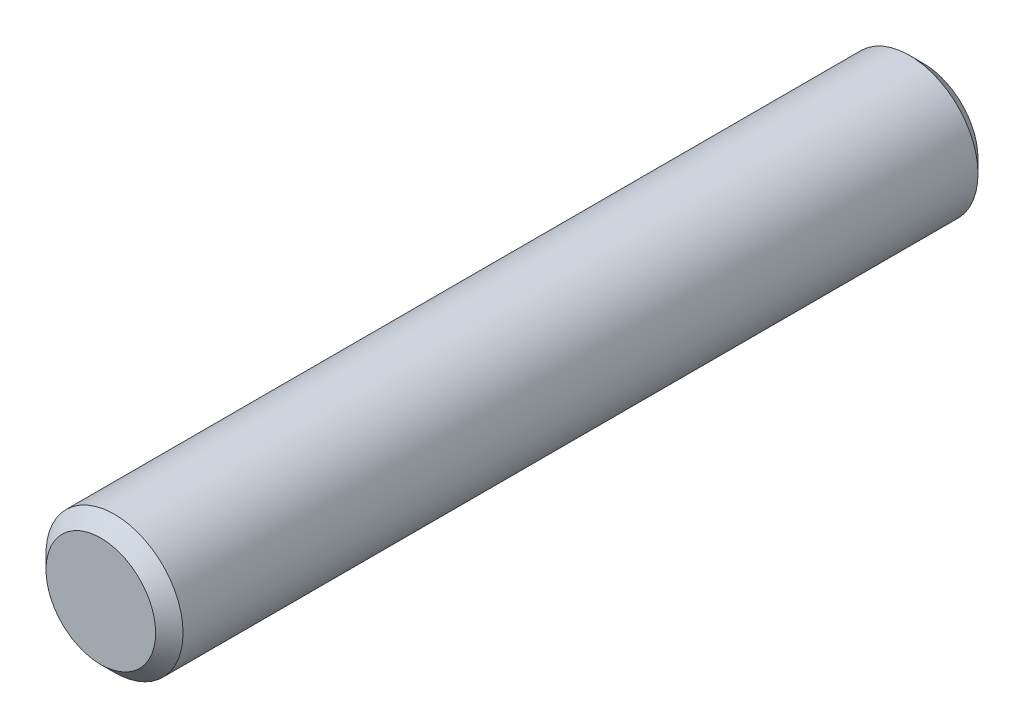
ISO-10303-21;
HEADER;
FILE_DESCRIPTION(('STEP AP214'),'2;1');
FILE_NAME('part.step','',(''),(''),'','','');
FILE_SCHEMA(('AUTOMOTIVE_DESIGN { 1 0 10303 214 1 1 1 1 }'));
ENDSEC;
DATA;
#1=APPLICATION_CONTEXT('core data for automotive mechanical design processes');
#2=APPLICATION_PROTOCOL_DEFINITION('international standard','automotive_design',2000,#1);
#3=PRODUCT_CONTEXT('',#1,'mechanical');
#4=PRODUCT('Part','Part','',(#3));
#5=PRODUCT_RELATED_PRODUCT_CATEGORY('part','',(#4));
#6=PRODUCT_DEFINITION_FORMATION('','',#4);
#7=PRODUCT_DEFINITION_CONTEXT('part definition',#1,'design');
#8=PRODUCT_DEFINITION('design','',#6,#7);
#9=PRODUCT_DEFINITION_SHAPE('','',#8);
#10=(LENGTH_UNIT() NAMED_UNIT(*) SI_UNIT(.MILLI.,.METRE.));
#11=(NAMED_UNIT(*) PLANE_ANGLE_UNIT() SI_UNIT($,.RADIAN.));
#12=(NAMED_UNIT(*) SI_UNIT($,.STERADIAN.) SOLID_ANGLE_UNIT());
#13=UNCERTAINTY_MEASURE_WITH_UNIT(LENGTH_MEASURE(1.E-05),#10,'distance_accuracy_value','');
#14=(GEOMETRIC_REPRESENTATION_CONTEXT(3) GLOBAL_UNCERTAINTY_ASSIGNED_CONTEXT((#13)) GLOBAL_UNIT_ASSIGNED_CONTEXT((#10,
#11,#12)) REPRESENTATION_CONTEXT('',''));
#15=CARTESIAN_POINT('',(0.,0.,0.));
#16=DIRECTION('',(0.,0.,1.));
#17=DIRECTION('',(1.,0.,0.));
#18=AXIS2_PLACEMENT_3D('',#15,#16,#17);
#19=CARTESIAN_POINT('',(0.,0.,60.));
#20=DIRECTION('',(0.,0.,-1.));
#21=DIRECTION('',(-1.,0.,0.));
#22=AXIS2_PLACEMENT_3D('',#19,#20,#21);
#23=CYLINDRICAL_SURFACE('',#22,5.);
#24=CARTESIAN_POINT('',(0.,0.,1.00000000000001));
#25=DIRECTION('',(0.,0.,1.));
#26=DIRECTION('',(1.,0.,0.));
#27=AXIS2_PLACEMENT_3D('',#24,#25,#26);
#28=CIRCLE('',#27,5.);
#29=CARTESIAN_POINT('',(5.,0.,1.00000000000001));
#30=VERTEX_POINT('',#29);
#31=EDGE_CURVE('E44',#30,#30,#28,.T.);
#32=ORIENTED_EDGE('',*,*,#31,.T.);
#33=EDGE_LOOP('',(#32));
#34=FACE_BOUND('',#33,.T.);
#35=CARTESIAN_POINT('',(0.,0.,59.));
#36=DIRECTION('',(0.,0.,1.));
#37=DIRECTION('',(1.,0.,0.));
#38=AXIS2_PLACEMENT_3D('',#35,#36,#37);
#39=CIRCLE('',#38,5.);
#40=CARTESIAN_POINT('',(5.,0.,59.));
#41=VERTEX_POINT('',#40);
#42=EDGE_CURVE('E48',#41,#41,#39,.F.);
#43=ORIENTED_EDGE('',*,*,#42,.T.);
#44=EDGE_LOOP('',(#43));
#45=FACE_BOUND('',#44,.T.);
#46=ADVANCED_FACE('F33',(#34,#45),#23,.T.);
#47=CARTESIAN_POINT('',(0.,0.,60.));
#48=DIRECTION('',(0.,0.,1.));
#49=DIRECTION('',(1.,0.,0.));
#50=AXIS2_PLACEMENT_3D('',#47,#48,#49);
#51=PLANE('',#50);
#52=CARTESIAN_POINT('',(0.,0.,60.));
#53=DIRECTION('',(0.,0.,1.));
#54=DIRECTION('',(1.,0.,0.));
#55=AXIS2_PLACEMENT_3D('',#52,#53,#54);
#56=CIRCLE('',#55,4.);
#57=CARTESIAN_POINT('',(4.,0.,60.));
#58=VERTEX_POINT('',#57);
#59=EDGE_CURVE('E10',#58,#58,#56,.T.);
#60=ORIENTED_EDGE('',*,*,#59,.T.);
#61=EDGE_LOOP('',(#60));
#62=FACE_BOUND('',#61,.T.);
#63=ADVANCED_FACE('F64',(#62),#51,.T.);
#64=CARTESIAN_POINT('',(0.,0.,0.));
#65=DIRECTION('',(0.,0.,1.));
#66=DIRECTION('',(1.,0.,0.));
#67=AXIS2_PLACEMENT_3D('',#64,#65,#66);
#68=PLANE('',#67);
#69=CARTESIAN_POINT('',(0.,0.,0.));
#70=DIRECTION('',(0.,0.,1.));
#71=DIRECTION('',(1.,0.,0.));
#72=AXIS2_PLACEMENT_3D('',#69,#70,#71);
#73=CIRCLE('',#72,4.);
#74=CARTESIAN_POINT('',(4.,0.,0.));
#75=VERTEX_POINT('',#74);
#76=EDGE_CURVE('E40',#75,#75,#73,.F.);
#77=ORIENTED_EDGE('',*,*,#76,.T.);
#78=EDGE_LOOP('',(#77));
#79=FACE_BOUND('',#78,.T.);
#80=ADVANCED_FACE('F61',(#79),#68,.F.);
#81=CARTESIAN_POINT('',(0.,0.,1.00000000000001));
#82=DIRECTION('',(0.,0.,1.));
#83=DIRECTION('',(1.,0.,0.));
#84=AXIS2_PLACEMENT_3D('',#81,#82,#83);
#85=CONICAL_SURFACE('',#84,5.,0.785398163397447);
#86=ORIENTED_EDGE('',*,*,#76,.F.);
#87=EDGE_LOOP('',(#86));
#88=FACE_BOUND('',#87,.T.);
#89=ORIENTED_EDGE('',*,*,#31,.F.);
#90=EDGE_LOOP('',(#89));
#91=FACE_BOUND('',#90,.T.);
#92=ADVANCED_FACE('F57',(#88,#91),#85,.T.);
#93=CARTESIAN_POINT('',(0.,0.,60.));
#94=DIRECTION('',(0.,0.,-1.));
#95=DIRECTION('',(-1.,0.,0.));
#96=AXIS2_PLACEMENT_3D('',#93,#94,#95);
#97=CONICAL_SURFACE('',#96,4.,0.785398163397443);
#98=ORIENTED_EDGE('',*,*,#42,.F.);
#99=EDGE_LOOP('',(#98));
#100=FACE_BOUND('',#99,.T.);
#101=ORIENTED_EDGE('',*,*,#59,.F.);
#102=EDGE_LOOP('',(#101));
#103=FACE_BOUND('',#102,.T.);
#104=ADVANCED_FACE('F35',(#100,#103),#97,.T.);
#105=CLOSED_SHELL('',(#46,#63,#80,#92,#104));
#106=MANIFOLD_SOLID_BREP('B2',#105);
#107=ADVANCED_BREP_SHAPE_REPRESENTATION('',(#18,#106),#14);
#108=SHAPE_DEFINITION_REPRESENTATION(#9,#107);
ENDSEC;
END-ISO-10303-21;
